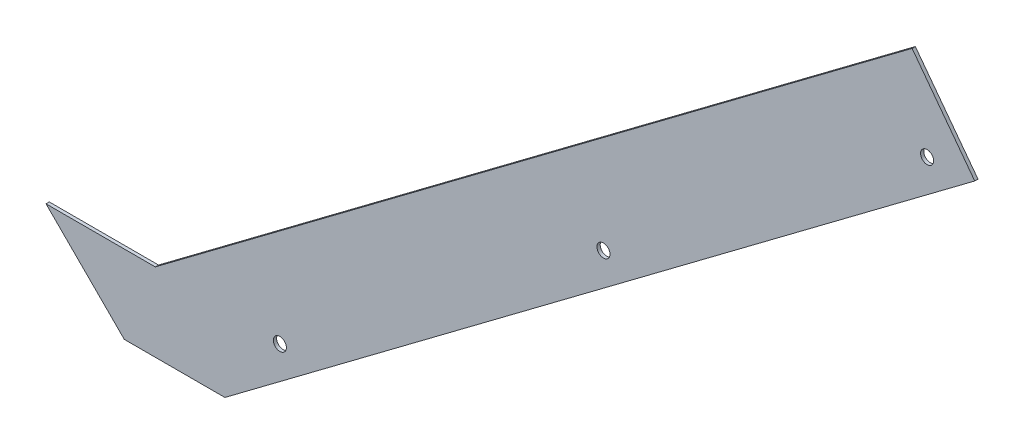
ISO-10303-21;
HEADER;
FILE_DESCRIPTION(('STEP AP214'),'2;1');
FILE_NAME('part.step','',(''),(''),'','','');
FILE_SCHEMA(('AUTOMOTIVE_DESIGN { 1 0 10303 214 1 1 1 1 }'));
ENDSEC;
DATA;
#1=APPLICATION_CONTEXT('core data for automotive mechanical design processes');
#2=APPLICATION_PROTOCOL_DEFINITION('international standard','automotive_design',2000,#1);
#3=PRODUCT_CONTEXT('',#1,'mechanical');
#4=PRODUCT('Part','Part','',(#3));
#5=PRODUCT_RELATED_PRODUCT_CATEGORY('part','',(#4));
#6=PRODUCT_DEFINITION_FORMATION('','',#4);
#7=PRODUCT_DEFINITION_CONTEXT('part definition',#1,'design');
#8=PRODUCT_DEFINITION('design','',#6,#7);
#9=PRODUCT_DEFINITION_SHAPE('','',#8);
#10=(LENGTH_UNIT() NAMED_UNIT(*) SI_UNIT(.MILLI.,.METRE.));
#11=(NAMED_UNIT(*) PLANE_ANGLE_UNIT() SI_UNIT($,.RADIAN.));
#12=(NAMED_UNIT(*) SI_UNIT($,.STERADIAN.) SOLID_ANGLE_UNIT());
#13=UNCERTAINTY_MEASURE_WITH_UNIT(LENGTH_MEASURE(1.E-05),#10,'distance_accuracy_value','');
#14=(GEOMETRIC_REPRESENTATION_CONTEXT(3) GLOBAL_UNCERTAINTY_ASSIGNED_CONTEXT((#13)) GLOBAL_UNIT_ASSIGNED_CONTEXT((#10,
#11,#12)) REPRESENTATION_CONTEXT('',''));
#15=CARTESIAN_POINT('',(0.,0.,0.));
#16=DIRECTION('',(0.,0.,1.));
#17=DIRECTION('',(1.,0.,0.));
#18=AXIS2_PLACEMENT_3D('',#15,#16,#17);
#19=CARTESIAN_POINT('',(38.1,-38.1,1.5875));
#20=DIRECTION('',(0.707106781186547,0.707106781186548,0.));
#21=DIRECTION('',(-0.707106781186548,0.707106781186547,0.));
#22=AXIS2_PLACEMENT_3D('',#19,#20,#21);
#23=PLANE('',#22);
#24=DIRECTION('',(0.707106781186548,-0.707106781186547,0.));
#25=VECTOR('',#24,1.);
#26=CARTESIAN_POINT('',(38.1,-38.1,0.));
#27=LINE('',#26,#25);
#28=CARTESIAN_POINT('',(0.,0.,0.));
#29=VERTEX_POINT('',#28);
#30=CARTESIAN_POINT('',(38.1,-38.1,0.));
#31=VERTEX_POINT('',#30);
#32=EDGE_CURVE('E127',#29,#31,#27,.T.);
#33=ORIENTED_EDGE('',*,*,#32,.T.);
#34=DIRECTION('',(0.,0.,-1.));
#35=VECTOR('',#34,1.);
#36=CARTESIAN_POINT('',(38.1,-38.1,1.5875));
#37=LINE('',#36,#35);
#38=CARTESIAN_POINT('',(38.1,-38.1,1.5875));
#39=VERTEX_POINT('',#38);
#40=EDGE_CURVE('E11',#39,#31,#37,.T.);
#41=ORIENTED_EDGE('',*,*,#40,.F.);
#42=DIRECTION('',(0.707106781186548,-0.707106781186547,0.));
#43=VECTOR('',#42,1.);
#44=CARTESIAN_POINT('',(38.1,-38.1,1.5875));
#45=LINE('',#44,#43);
#46=CARTESIAN_POINT('',(0.,0.,1.5875));
#47=VERTEX_POINT('',#46);
#48=EDGE_CURVE('E144',#47,#39,#45,.T.);
#49=ORIENTED_EDGE('',*,*,#48,.F.);
#50=DIRECTION('',(0.,0.,-1.));
#51=VECTOR('',#50,1.);
#52=CARTESIAN_POINT('',(0.,0.,1.5875));
#53=LINE('',#52,#51);
#54=EDGE_CURVE('E123',#47,#29,#53,.T.);
#55=ORIENTED_EDGE('',*,*,#54,.T.);
#56=EDGE_LOOP('',(#33,#41,#49,#55));
#57=FACE_BOUND('',#56,.T.);
#58=ADVANCED_FACE('F38',(#57),#23,.F.);
#59=CARTESIAN_POINT('',(87.0479166666668,-38.1,1.5875));
#60=DIRECTION('',(0.,1.,0.));
#61=DIRECTION('',(0.,0.,1.));
#62=AXIS2_PLACEMENT_3D('',#59,#60,#61);
#63=PLANE('',#62);
#64=DIRECTION('',(1.,0.,0.));
#65=VECTOR('',#64,1.);
#66=CARTESIAN_POINT('',(87.0479166666668,-38.1,0.));
#67=LINE('',#66,#65);
#68=CARTESIAN_POINT('',(87.0479166666668,-38.1,0.));
#69=VERTEX_POINT('',#68);
#70=EDGE_CURVE('E131',#31,#69,#67,.T.);
#71=ORIENTED_EDGE('',*,*,#70,.T.);
#72=DIRECTION('',(0.,0.,-1.));
#73=VECTOR('',#72,1.);
#74=CARTESIAN_POINT('',(87.0479166666668,-38.1,1.5875));
#75=LINE('',#74,#73);
#76=CARTESIAN_POINT('',(87.0479166666668,-38.1,1.5875));
#77=VERTEX_POINT('',#76);
#78=EDGE_CURVE('E47',#77,#69,#75,.T.);
#79=ORIENTED_EDGE('',*,*,#78,.F.);
#80=DIRECTION('',(1.,0.,0.));
#81=VECTOR('',#80,1.);
#82=CARTESIAN_POINT('',(87.0479166666668,-38.1,1.5875));
#83=LINE('',#82,#81);
#84=EDGE_CURVE('E92',#39,#77,#83,.T.);
#85=ORIENTED_EDGE('',*,*,#84,.F.);
#86=ORIENTED_EDGE('',*,*,#40,.T.);
#87=EDGE_LOOP('',(#71,#79,#85,#86));
#88=FACE_BOUND('',#87,.T.);
#89=ADVANCED_FACE('F174',(#88),#63,.F.);
#90=CARTESIAN_POINT('',(451.96125,235.585,1.5875));
#91=DIRECTION('',(-0.6,0.8,0.));
#92=DIRECTION('',(-0.8,-0.6,0.));
#93=AXIS2_PLACEMENT_3D('',#90,#91,#92);
#94=PLANE('',#93);
#95=DIRECTION('',(0.8,0.6,0.));
#96=VECTOR('',#95,1.);
#97=CARTESIAN_POINT('',(451.96125,235.585,0.));
#98=LINE('',#97,#96);
#99=CARTESIAN_POINT('',(451.96125,235.585,0.));
#100=VERTEX_POINT('',#99);
#101=EDGE_CURVE('E135',#69,#100,#98,.T.);
#102=ORIENTED_EDGE('',*,*,#101,.T.);
#103=DIRECTION('',(0.,0.,-1.));
#104=VECTOR('',#103,1.);
#105=CARTESIAN_POINT('',(451.96125,235.585,1.5875));
#106=LINE('',#105,#104);
#107=CARTESIAN_POINT('',(451.96125,235.585,1.5875));
#108=VERTEX_POINT('',#107);
#109=EDGE_CURVE('E116',#108,#100,#106,.T.);
#110=ORIENTED_EDGE('',*,*,#109,.F.);
#111=DIRECTION('',(0.8,0.6,0.));
#112=VECTOR('',#111,1.);
#113=CARTESIAN_POINT('',(451.96125,235.585,1.5875));
#114=LINE('',#113,#112);
#115=EDGE_CURVE('E105',#77,#108,#114,.T.);
#116=ORIENTED_EDGE('',*,*,#115,.F.);
#117=ORIENTED_EDGE('',*,*,#78,.T.);
#118=EDGE_LOOP('',(#102,#110,#116,#117));
#119=FACE_BOUND('',#118,.T.);
#120=ADVANCED_FACE('F154',(#119),#94,.F.);
#121=CARTESIAN_POINT('',(421.48125,276.225,1.5875));
#122=DIRECTION('',(-0.799999999999999,-0.600000000000001,0.));
#123=DIRECTION('',(0.600000000000001,-0.799999999999999,0.));
#124=AXIS2_PLACEMENT_3D('',#121,#122,#123);
#125=PLANE('',#124);
#126=DIRECTION('',(-0.600000000000001,0.799999999999999,0.));
#127=VECTOR('',#126,1.);
#128=CARTESIAN_POINT('',(421.48125,276.225,0.));
#129=LINE('',#128,#127);
#130=CARTESIAN_POINT('',(421.48125,276.225,0.));
#131=VERTEX_POINT('',#130);
#132=EDGE_CURVE('E114',#100,#131,#129,.T.);
#133=ORIENTED_EDGE('',*,*,#132,.T.);
#134=DIRECTION('',(0.,0.,-1.));
#135=VECTOR('',#134,1.);
#136=CARTESIAN_POINT('',(421.48125,276.225,1.5875));
#137=LINE('',#136,#135);
#138=CARTESIAN_POINT('',(421.48125,276.225,1.5875));
#139=VERTEX_POINT('',#138);
#140=EDGE_CURVE('E111',#139,#131,#137,.T.);
#141=ORIENTED_EDGE('',*,*,#140,.F.);
#142=DIRECTION('',(-0.600000000000001,0.799999999999999,0.));
#143=VECTOR('',#142,1.);
#144=CARTESIAN_POINT('',(421.48125,276.225,1.5875));
#145=LINE('',#144,#143);
#146=EDGE_CURVE('E99',#108,#139,#145,.T.);
#147=ORIENTED_EDGE('',*,*,#146,.F.);
#148=ORIENTED_EDGE('',*,*,#109,.T.);
#149=EDGE_LOOP('',(#133,#141,#147,#148));
#150=FACE_BOUND('',#149,.T.);
#151=ADVANCED_FACE('F112',(#150),#125,.F.);
#152=CARTESIAN_POINT('',(53.18125,0.,1.5875));
#153=DIRECTION('',(0.6,-0.8,0.));
#154=DIRECTION('',(0.8,0.6,0.));
#155=AXIS2_PLACEMENT_3D('',#152,#153,#154);
#156=PLANE('',#155);
#157=DIRECTION('',(-0.8,-0.6,0.));
#158=VECTOR('',#157,1.);
#159=CARTESIAN_POINT('',(53.18125,0.,0.));
#160=LINE('',#159,#158);
#161=CARTESIAN_POINT('',(53.18125,0.,0.));
#162=VERTEX_POINT('',#161);
#163=EDGE_CURVE('E78',#131,#162,#160,.T.);
#164=ORIENTED_EDGE('',*,*,#163,.T.);
#165=DIRECTION('',(0.,0.,-1.));
#166=VECTOR('',#165,1.);
#167=CARTESIAN_POINT('',(53.18125,0.,1.5875));
#168=LINE('',#167,#166);
#169=CARTESIAN_POINT('',(53.18125,0.,1.5875));
#170=VERTEX_POINT('',#169);
#171=EDGE_CURVE('E117',#170,#162,#168,.T.);
#172=ORIENTED_EDGE('',*,*,#171,.F.);
#173=DIRECTION('',(-0.8,-0.6,0.));
#174=VECTOR('',#173,1.);
#175=CARTESIAN_POINT('',(53.18125,0.,1.5875));
#176=LINE('',#175,#174);
#177=EDGE_CURVE('E103',#139,#170,#176,.T.);
#178=ORIENTED_EDGE('',*,*,#177,.F.);
#179=ORIENTED_EDGE('',*,*,#140,.T.);
#180=EDGE_LOOP('',(#164,#172,#178,#179));
#181=FACE_BOUND('',#180,.T.);
#182=ADVANCED_FACE('F119',(#181),#156,.F.);
#183=CARTESIAN_POINT('',(0.,0.,1.5875));
#184=DIRECTION('',(0.,-1.,0.));
#185=DIRECTION('',(0.,0.,-1.));
#186=AXIS2_PLACEMENT_3D('',#183,#184,#185);
#187=PLANE('',#186);
#188=DIRECTION('',(-1.,0.,0.));
#189=VECTOR('',#188,1.);
#190=CARTESIAN_POINT('',(0.,0.,0.));
#191=LINE('',#190,#189);
#192=EDGE_CURVE('E84',#162,#29,#191,.T.);
#193=ORIENTED_EDGE('',*,*,#192,.T.);
#194=ORIENTED_EDGE('',*,*,#54,.F.);
#195=DIRECTION('',(-1.,0.,0.));
#196=VECTOR('',#195,1.);
#197=CARTESIAN_POINT('',(0.,0.,1.5875));
#198=LINE('',#197,#196);
#199=EDGE_CURVE('E55',#170,#47,#198,.T.);
#200=ORIENTED_EDGE('',*,*,#199,.F.);
#201=ORIENTED_EDGE('',*,*,#171,.T.);
#202=EDGE_LOOP('',(#193,#194,#200,#201));
#203=FACE_BOUND('',#202,.T.);
#204=ADVANCED_FACE('F161',(#203),#187,.F.);
#205=CARTESIAN_POINT('',(0.,0.,1.5875));
#206=DIRECTION('',(0.,0.,-1.));
#207=DIRECTION('',(-1.,0.,0.));
#208=AXIS2_PLACEMENT_3D('',#205,#206,#207);
#209=PLANE('',#208);
#210=CARTESIAN_POINT('',(428.77096872,234.06728904,1.5875));
#211=DIRECTION('',(0.,0.,1.));
#212=DIRECTION('',(1.,0.,0.));
#213=AXIS2_PLACEMENT_3D('',#210,#211,#212);
#214=CIRCLE('',#213,3.17499999999998);
#215=CARTESIAN_POINT('',(431.94596872,234.06728904,1.5875));
#216=VERTEX_POINT('',#215);
#217=EDGE_CURVE('E245',#216,#216,#214,.T.);
#218=ORIENTED_EDGE('',*,*,#217,.F.);
#219=EDGE_LOOP('',(#218));
#220=FACE_BOUND('',#219,.T.);
#221=CARTESIAN_POINT('',(271.29096872,115.95728904,1.5875));
#222=DIRECTION('',(0.,0.,1.));
#223=DIRECTION('',(1.,0.,0.));
#224=AXIS2_PLACEMENT_3D('',#221,#222,#223);
#225=CIRCLE('',#224,3.17499999999998);
#226=CARTESIAN_POINT('',(274.46596872,115.95728904,1.5875));
#227=VERTEX_POINT('',#226);
#228=EDGE_CURVE('E249',#227,#227,#225,.T.);
#229=ORIENTED_EDGE('',*,*,#228,.F.);
#230=EDGE_LOOP('',(#229));
#231=FACE_BOUND('',#230,.T.);
#232=CARTESIAN_POINT('',(113.81096872,-2.15271095999997,1.5875));
#233=DIRECTION('',(0.,0.,1.));
#234=DIRECTION('',(1.,0.,0.));
#235=AXIS2_PLACEMENT_3D('',#232,#233,#234);
#236=CIRCLE('',#235,3.17499999999998);
#237=CARTESIAN_POINT('',(116.98596872,-2.15271095999997,1.5875));
#238=VERTEX_POINT('',#237);
#239=EDGE_CURVE('E259',#238,#238,#236,.T.);
#240=ORIENTED_EDGE('',*,*,#239,.F.);
#241=EDGE_LOOP('',(#240));
#242=FACE_BOUND('',#241,.T.);
#243=ORIENTED_EDGE('',*,*,#48,.T.);
#244=ORIENTED_EDGE('',*,*,#84,.T.);
#245=ORIENTED_EDGE('',*,*,#115,.T.);
#246=ORIENTED_EDGE('',*,*,#146,.T.);
#247=ORIENTED_EDGE('',*,*,#177,.T.);
#248=ORIENTED_EDGE('',*,*,#199,.T.);
#249=EDGE_LOOP('',(#243,#244,#245,#246,#247,#248));
#250=FACE_BOUND('',#249,.T.);
#251=ADVANCED_FACE('F101',(#220,#231,#242,#250),#209,.F.);
#252=CARTESIAN_POINT('',(0.,0.,0.));
#253=DIRECTION('',(0.,0.,-1.));
#254=DIRECTION('',(-1.,0.,0.));
#255=AXIS2_PLACEMENT_3D('',#252,#253,#254);
#256=PLANE('',#255);
#257=CARTESIAN_POINT('',(428.77096872,234.06728904,0.));
#258=DIRECTION('',(0.,0.,1.));
#259=DIRECTION('',(1.,0.,0.));
#260=AXIS2_PLACEMENT_3D('',#257,#258,#259);
#261=CIRCLE('',#260,3.17499999999998);
#262=CARTESIAN_POINT('',(431.94596872,234.06728904,0.));
#263=VERTEX_POINT('',#262);
#264=EDGE_CURVE('E242',#263,#263,#261,.T.);
#265=ORIENTED_EDGE('',*,*,#264,.T.);
#266=EDGE_LOOP('',(#265));
#267=FACE_BOUND('',#266,.T.);
#268=CARTESIAN_POINT('',(271.29096872,115.95728904,0.));
#269=DIRECTION('',(0.,0.,1.));
#270=DIRECTION('',(1.,0.,0.));
#271=AXIS2_PLACEMENT_3D('',#268,#269,#270);
#272=CIRCLE('',#271,3.17499999999998);
#273=CARTESIAN_POINT('',(274.46596872,115.95728904,0.));
#274=VERTEX_POINT('',#273);
#275=EDGE_CURVE('E255',#274,#274,#272,.T.);
#276=ORIENTED_EDGE('',*,*,#275,.T.);
#277=EDGE_LOOP('',(#276));
#278=FACE_BOUND('',#277,.T.);
#279=CARTESIAN_POINT('',(113.81096872,-2.15271095999997,0.));
#280=DIRECTION('',(0.,0.,1.));
#281=DIRECTION('',(1.,0.,0.));
#282=AXIS2_PLACEMENT_3D('',#279,#280,#281);
#283=CIRCLE('',#282,3.175);
#284=CARTESIAN_POINT('',(116.98596872,-2.15271095999997,0.));
#285=VERTEX_POINT('',#284);
#286=EDGE_CURVE('E132',#285,#285,#283,.T.);
#287=ORIENTED_EDGE('',*,*,#286,.T.);
#288=EDGE_LOOP('',(#287));
#289=FACE_BOUND('',#288,.T.);
#290=ORIENTED_EDGE('',*,*,#32,.F.);
#291=ORIENTED_EDGE('',*,*,#192,.F.);
#292=ORIENTED_EDGE('',*,*,#163,.F.);
#293=ORIENTED_EDGE('',*,*,#132,.F.);
#294=ORIENTED_EDGE('',*,*,#101,.F.);
#295=ORIENTED_EDGE('',*,*,#70,.F.);
#296=EDGE_LOOP('',(#290,#291,#292,#293,#294,#295));
#297=FACE_BOUND('',#296,.T.);
#298=ADVANCED_FACE('F157',(#267,#278,#289,#297),#256,.T.);
#299=CARTESIAN_POINT('',(113.81096872,-2.15271095999997,1.5875));
#300=DIRECTION('',(0.,0.,1.));
#301=DIRECTION('',(1.,0.,0.));
#302=AXIS2_PLACEMENT_3D('',#299,#300,#301);
#303=CYLINDRICAL_SURFACE('',#302,3.17499999999999);
#304=ORIENTED_EDGE('',*,*,#286,.F.);
#305=EDGE_LOOP('',(#304));
#306=FACE_BOUND('',#305,.T.);
#307=ORIENTED_EDGE('',*,*,#239,.T.);
#308=EDGE_LOOP('',(#307));
#309=FACE_BOUND('',#308,.T.);
#310=ADVANCED_FACE('F207',(#306,#309),#303,.F.);
#311=CARTESIAN_POINT('',(271.29096872,115.95728904,1.5875));
#312=DIRECTION('',(0.,0.,1.));
#313=DIRECTION('',(1.,0.,0.));
#314=AXIS2_PLACEMENT_3D('',#311,#312,#313);
#315=CYLINDRICAL_SURFACE('',#314,3.17499999999998);
#316=ORIENTED_EDGE('',*,*,#275,.F.);
#317=EDGE_LOOP('',(#316));
#318=FACE_BOUND('',#317,.T.);
#319=ORIENTED_EDGE('',*,*,#228,.T.);
#320=EDGE_LOOP('',(#319));
#321=FACE_BOUND('',#320,.T.);
#322=ADVANCED_FACE('F215',(#318,#321),#315,.F.);
#323=CARTESIAN_POINT('',(428.77096872,234.06728904,1.5875));
#324=DIRECTION('',(0.,0.,1.));
#325=DIRECTION('',(1.,0.,0.));
#326=AXIS2_PLACEMENT_3D('',#323,#324,#325);
#327=CYLINDRICAL_SURFACE('',#326,3.17499999999998);
#328=ORIENTED_EDGE('',*,*,#264,.F.);
#329=EDGE_LOOP('',(#328));
#330=FACE_BOUND('',#329,.T.);
#331=ORIENTED_EDGE('',*,*,#217,.T.);
#332=EDGE_LOOP('',(#331));
#333=FACE_BOUND('',#332,.T.);
#334=ADVANCED_FACE('F225',(#330,#333),#327,.F.);
#335=CLOSED_SHELL('',(#58,#89,#120,#151,#182,#204,#251,#298,#310,#322,#334));
#336=MANIFOLD_SOLID_BREP('B2',#335);
#337=ADVANCED_BREP_SHAPE_REPRESENTATION('',(#18,#336),#14);
#338=SHAPE_DEFINITION_REPRESENTATION(#9,#337);
ENDSEC;
END-ISO-10303-21;
